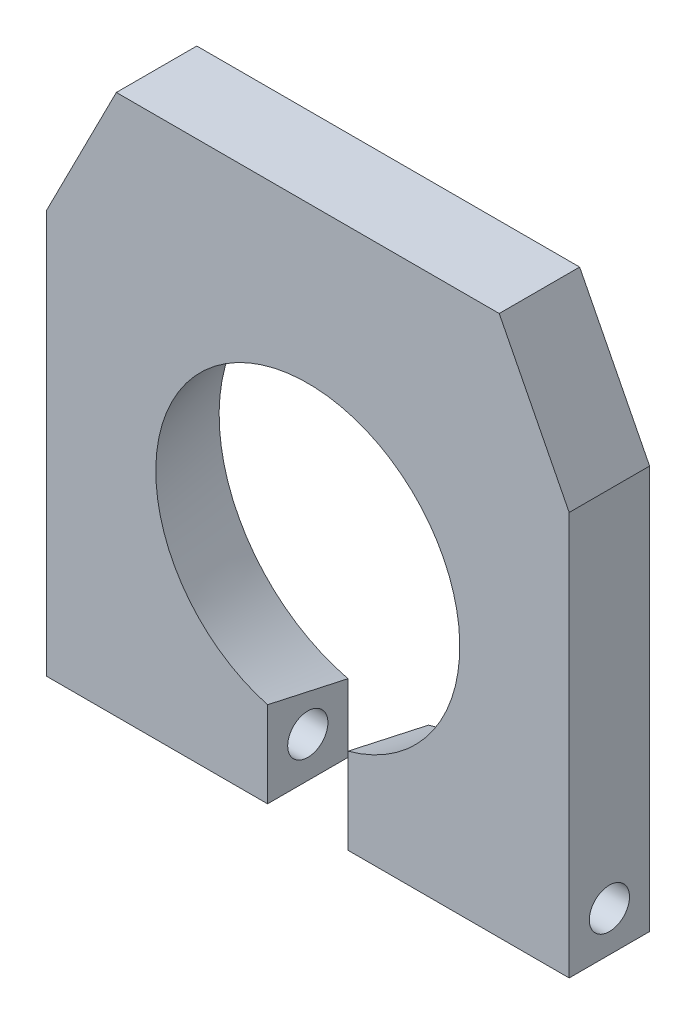
ISO-10303-21;
HEADER;
FILE_DESCRIPTION(('STEP AP214'),'2;1');
FILE_NAME('part.step','',(''),(''),'','','');
FILE_SCHEMA(('AUTOMOTIVE_DESIGN { 1 0 10303 214 1 1 1 1 }'));
ENDSEC;
DATA;
#1=APPLICATION_CONTEXT('core data for automotive mechanical design processes');
#2=APPLICATION_PROTOCOL_DEFINITION('international standard','automotive_design',2000,#1);
#3=PRODUCT_CONTEXT('',#1,'mechanical');
#4=PRODUCT('Part','Part','',(#3));
#5=PRODUCT_RELATED_PRODUCT_CATEGORY('part','',(#4));
#6=PRODUCT_DEFINITION_FORMATION('','',#4);
#7=PRODUCT_DEFINITION_CONTEXT('part definition',#1,'design');
#8=PRODUCT_DEFINITION('design','',#6,#7);
#9=PRODUCT_DEFINITION_SHAPE('','',#8);
#10=(LENGTH_UNIT() NAMED_UNIT(*) SI_UNIT(.MILLI.,.METRE.));
#11=(NAMED_UNIT(*) PLANE_ANGLE_UNIT() SI_UNIT($,.RADIAN.));
#12=(NAMED_UNIT(*) SI_UNIT($,.STERADIAN.) SOLID_ANGLE_UNIT());
#13=UNCERTAINTY_MEASURE_WITH_UNIT(LENGTH_MEASURE(1.E-05),#10,'distance_accuracy_value','');
#14=(GEOMETRIC_REPRESENTATION_CONTEXT(3) GLOBAL_UNCERTAINTY_ASSIGNED_CONTEXT((#13)) GLOBAL_UNIT_ASSIGNED_CONTEXT((#10,
#11,#12)) REPRESENTATION_CONTEXT('',''));
#15=CARTESIAN_POINT('',(0.,0.,0.));
#16=DIRECTION('',(0.,0.,1.));
#17=DIRECTION('',(1.,0.,0.));
#18=AXIS2_PLACEMENT_3D('',#15,#16,#17);
#19=CARTESIAN_POINT('',(34.925,-85.344,12.7));
#20=DIRECTION('',(-1.,0.,0.));
#21=DIRECTION('',(0.,-1.,0.));
#22=AXIS2_PLACEMENT_3D('',#19,#20,#21);
#23=PLANE('',#22);
#24=CARTESIAN_POINT('',(34.925,-78.994,6.35));
#25=DIRECTION('',(-1.,0.,0.));
#26=DIRECTION('',(0.,-1.,0.));
#27=AXIS2_PLACEMENT_3D('',#24,#25,#26);
#28=CIRCLE('',#27,3.175);
#29=CARTESIAN_POINT('',(34.925,-82.169,6.35));
#30=VERTEX_POINT('',#29);
#31=EDGE_CURVE('E139',#30,#30,#28,.T.);
#32=ORIENTED_EDGE('',*,*,#31,.T.);
#33=EDGE_LOOP('',(#32));
#34=FACE_BOUND('',#33,.T.);
#35=CARTESIAN_POINT('',(34.925,-68.7518218438866,26.4062128132452));
#36=CARTESIAN_POINT('',(34.925,-69.2101082432902,24.3501353727112));
#37=CARTESIAN_POINT('',(34.925,-69.6670810112696,22.2937656501442));
#38=CARTESIAN_POINT('',(34.925,-70.5787936427447,18.1805319832655));
#39=CARTESIAN_POINT('',(34.925,-71.0335335070522,16.1236680391338));
#40=CARTESIAN_POINT('',(34.925,-71.9411742009615,12.0095384988081));
#41=CARTESIAN_POINT('',(34.925,-72.3940750338895,9.95227290334756));
#42=CARTESIAN_POINT('',(34.925,-73.2983218476056,5.83739988256473));
#43=CARTESIAN_POINT('',(34.925,-73.7496678282345,3.77979245720744));
#44=CARTESIAN_POINT('',(34.925,-75.1017360117453,-2.3934562114455));
#45=CARTESIAN_POINT('',(34.925,-76.0004895207628,-6.50952867815485));
#46=CARTESIAN_POINT('',(34.925,-77.345707698084,-12.6842752229148));
#47=CARTESIAN_POINT('',(34.925,-77.7936288286481,-14.7426323113781));
#48=CARTESIAN_POINT('',(34.925,-78.6886164059858,-18.8595321946598));
#49=CARTESIAN_POINT('',(34.925,-79.135682852801,-20.9180749894692));
#50=CARTESIAN_POINT('',(34.925,-79.5823801274732,-22.9766979270119));
#51=B_SPLINE_CURVE_WITH_KNOTS('',3,(#35,#36,#37,#38,#39,#40,#41,#42,#43,#44,#45,#46,#47,#48,#49,
#50),.UNSPECIFIED.,.F.,.F.,(4,2,2,2,2,2,2,4),(0.,6.31959754261499,12.6391927880124,
18.9587765980228,25.2783610546314,37.9175151276736,44.2371040303297,50.5566926256409),.UNSPECIFIED.);
#52=CARTESIAN_POINT('',(34.925,-71.7887078184193,12.7));
#53=VERTEX_POINT('',#52);
#54=CARTESIAN_POINT('',(34.925,-74.5773590048811,0.));
#55=VERTEX_POINT('',#54);
#56=EDGE_CURVE('E175',#53,#55,#51,.T.);
#57=ORIENTED_EDGE('',*,*,#56,.F.);
#58=DIRECTION('',(0.,1.,0.));
#59=VECTOR('',#58,1.);
#60=CARTESIAN_POINT('',(34.925,-85.344,12.7));
#61=LINE('',#60,#59);
#62=CARTESIAN_POINT('',(34.925,-85.344,12.7));
#63=VERTEX_POINT('',#62);
#64=EDGE_CURVE('E177',#63,#53,#61,.T.);
#65=ORIENTED_EDGE('',*,*,#64,.F.);
#66=DIRECTION('',(0.,0.,-1.));
#67=VECTOR('',#66,1.);
#68=CARTESIAN_POINT('',(34.925,-85.344,12.7));
#69=LINE('',#68,#67);
#70=CARTESIAN_POINT('',(34.925,-85.344,0.));
#71=VERTEX_POINT('',#70);
#72=EDGE_CURVE('E155',#63,#71,#69,.T.);
#73=ORIENTED_EDGE('',*,*,#72,.T.);
#74=DIRECTION('',(0.,1.,0.));
#75=VECTOR('',#74,1.);
#76=CARTESIAN_POINT('',(34.925,-85.344,0.));
#77=LINE('',#76,#75);
#78=EDGE_CURVE('E141',#71,#55,#77,.T.);
#79=ORIENTED_EDGE('',*,*,#78,.T.);
#80=EDGE_LOOP('',(#57,#65,#73,#79));
#81=FACE_BOUND('',#80,.T.);
#82=ADVANCED_FACE('F32',(#34,#81),#23,.F.);
#83=CARTESIAN_POINT('',(47.625,-71.7887078184193,12.7));
#84=DIRECTION('',(1.,0.,0.));
#85=DIRECTION('',(0.,1.,0.));
#86=AXIS2_PLACEMENT_3D('',#83,#84,#85);
#87=PLANE('',#86);
#88=CARTESIAN_POINT('',(47.625,-78.994,6.35));
#89=DIRECTION('',(1.,0.,0.));
#90=DIRECTION('',(0.,1.,0.));
#91=AXIS2_PLACEMENT_3D('',#88,#89,#90);
#92=CIRCLE('',#91,3.175);
#93=CARTESIAN_POINT('',(47.625,-75.819,6.35));
#94=VERTEX_POINT('',#93);
#95=EDGE_CURVE('E257',#94,#94,#92,.T.);
#96=ORIENTED_EDGE('',*,*,#95,.T.);
#97=EDGE_LOOP('',(#96));
#98=FACE_BOUND('',#97,.T.);
#99=CARTESIAN_POINT('',(47.625,-79.5823801274732,-22.9766979270119));
#100=CARTESIAN_POINT('',(47.625,-79.135682852801,-20.9180749894692));
#101=CARTESIAN_POINT('',(47.625,-78.6886164059858,-18.8595321946598));
#102=CARTESIAN_POINT('',(47.625,-77.7936288286481,-14.7426323113781));
#103=CARTESIAN_POINT('',(47.625,-77.345707698084,-12.6842752229148));
#104=CARTESIAN_POINT('',(47.625,-76.0004895207628,-6.50952867815484));
#105=CARTESIAN_POINT('',(47.625,-75.1017360117453,-2.3934562114455));
#106=CARTESIAN_POINT('',(47.625,-73.7496678282345,3.77979245720745));
#107=CARTESIAN_POINT('',(47.625,-73.2983218476056,5.83739988256473));
#108=CARTESIAN_POINT('',(47.625,-72.3940750338895,9.95227290334757));
#109=CARTESIAN_POINT('',(47.625,-71.9411742009615,12.0095384988081));
#110=CARTESIAN_POINT('',(47.625,-71.0335335070522,16.1236680391338));
#111=CARTESIAN_POINT('',(47.625,-70.5787936427447,18.1805319832655));
#112=CARTESIAN_POINT('',(47.625,-69.6670810112696,22.2937656501442));
#113=CARTESIAN_POINT('',(47.625,-69.2101082432902,24.3501353727112));
#114=CARTESIAN_POINT('',(47.625,-68.7518218438866,26.4062128132452));
#115=B_SPLINE_CURVE_WITH_KNOTS('',3,(#99,#100,#101,#102,#103,#104,#105,#106,#107,#108,#109,#110,
#111,#112,#113,#114),.UNSPECIFIED.,.F.,.F.,(4,2,2,2,2,2,2,4),(0.,6.31958859531121,
12.6391774979673,25.2783315710095,31.597916027618,37.9174998376285,44.2370950830259,
50.5566926256409),.UNSPECIFIED.);
#116=CARTESIAN_POINT('',(47.625,-74.5773590048811,0.));
#117=VERTEX_POINT('',#116);
#118=CARTESIAN_POINT('',(47.625,-71.7887078184193,12.7));
#119=VERTEX_POINT('',#118);
#120=EDGE_CURVE('E201',#117,#119,#115,.T.);
#121=ORIENTED_EDGE('',*,*,#120,.F.);
#122=DIRECTION('',(0.,-1.,0.));
#123=VECTOR('',#122,1.);
#124=CARTESIAN_POINT('',(47.625,-71.7887078184193,0.));
#125=LINE('',#124,#123);
#126=CARTESIAN_POINT('',(47.625,-85.344,0.));
#127=VERTEX_POINT('',#126);
#128=EDGE_CURVE('E144',#117,#127,#125,.T.);
#129=ORIENTED_EDGE('',*,*,#128,.T.);
#130=DIRECTION('',(0.,0.,-1.));
#131=VECTOR('',#130,1.);
#132=CARTESIAN_POINT('',(47.625,-85.344,12.7));
#133=LINE('',#132,#131);
#134=CARTESIAN_POINT('',(47.625,-85.344,12.7));
#135=VERTEX_POINT('',#134);
#136=EDGE_CURVE('E130',#135,#127,#133,.T.);
#137=ORIENTED_EDGE('',*,*,#136,.F.);
#138=DIRECTION('',(0.,-1.,0.));
#139=VECTOR('',#138,1.);
#140=CARTESIAN_POINT('',(47.625,-71.7887078184193,12.7));
#141=LINE('',#140,#139);
#142=EDGE_CURVE('E181',#119,#135,#141,.T.);
#143=ORIENTED_EDGE('',*,*,#142,.F.);
#144=EDGE_LOOP('',(#121,#129,#137,#143));
#145=FACE_BOUND('',#144,.T.);
#146=ADVANCED_FACE('F218',(#98,#145),#87,.F.);
#147=CARTESIAN_POINT('',(41.275,-48.644,0.));
#148=DIRECTION('',(0.,0.,1.));
#149=DIRECTION('',(1.,0.,0.));
#150=AXIS2_PLACEMENT_3D('',#147,#148,#149);
#151=PLANE('',#150);
#152=DIRECTION('',(0.,-1.,0.));
#153=VECTOR('',#152,1.);
#154=CARTESIAN_POINT('',(0.,0.,0.));
#155=LINE('',#154,#153);
#156=CARTESIAN_POINT('',(0.,-21.6848834753268,0.));
#157=VERTEX_POINT('',#156);
#158=CARTESIAN_POINT('',(0.,-85.344,0.));
#159=VERTEX_POINT('',#158);
#160=EDGE_CURVE('E136',#157,#159,#155,.T.);
#161=ORIENTED_EDGE('',*,*,#160,.F.);
#162=DIRECTION('',(-0.453990499739541,-0.891006524188371,0.));
#163=VECTOR('',#162,1.);
#164=CARTESIAN_POINT('',(11.049,0.,0.));
#165=LINE('',#164,#163);
#166=CARTESIAN_POINT('',(11.049,0.,0.));
#167=VERTEX_POINT('',#166);
#168=EDGE_CURVE('E113',#167,#157,#165,.T.);
#169=ORIENTED_EDGE('',*,*,#168,.F.);
#170=DIRECTION('',(-1.,0.,0.));
#171=VECTOR('',#170,1.);
#172=CARTESIAN_POINT('',(0.,0.,0.));
#173=LINE('',#172,#171);
#174=CARTESIAN_POINT('',(71.501,0.,0.));
#175=VERTEX_POINT('',#174);
#176=EDGE_CURVE('E121',#175,#167,#173,.T.);
#177=ORIENTED_EDGE('',*,*,#176,.F.);
#178=DIRECTION('',(-0.453990499739541,0.891006524188371,0.));
#179=VECTOR('',#178,1.);
#180=CARTESIAN_POINT('',(71.501,0.,0.));
#181=LINE('',#180,#179);
#182=CARTESIAN_POINT('',(82.55,-21.6848834753268,0.));
#183=VERTEX_POINT('',#182);
#184=EDGE_CURVE('E203',#183,#175,#181,.T.);
#185=ORIENTED_EDGE('',*,*,#184,.F.);
#186=DIRECTION('',(0.,1.,0.));
#187=VECTOR('',#186,1.);
#188=CARTESIAN_POINT('',(82.55,0.,0.));
#189=LINE('',#188,#187);
#190=CARTESIAN_POINT('',(82.55,-85.344,0.));
#191=VERTEX_POINT('',#190);
#192=EDGE_CURVE('E148',#191,#183,#189,.T.);
#193=ORIENTED_EDGE('',*,*,#192,.F.);
#194=DIRECTION('',(1.,0.,0.));
#195=VECTOR('',#194,1.);
#196=CARTESIAN_POINT('',(47.625,-85.344,0.));
#197=LINE('',#196,#195);
#198=EDGE_CURVE('E146',#127,#191,#197,.T.);
#199=ORIENTED_EDGE('',*,*,#198,.F.);
#200=ORIENTED_EDGE('',*,*,#128,.F.);
#201=CARTESIAN_POINT('',(41.275,-48.644,0.));
#202=DIRECTION('',(0.,0.,1.));
#203=DIRECTION('',(1.,0.,0.));
#204=AXIS2_PLACEMENT_3D('',#201,#202,#203);
#205=CIRCLE('',#204,26.6994683332093);
#206=EDGE_CURVE('E11',#55,#117,#205,.F.);
#207=ORIENTED_EDGE('',*,*,#206,.F.);
#208=ORIENTED_EDGE('',*,*,#78,.F.);
#209=DIRECTION('',(1.,0.,0.));
#210=VECTOR('',#209,1.);
#211=CARTESIAN_POINT('',(0.,-85.344,0.));
#212=LINE('',#211,#210);
#213=EDGE_CURVE('E138',#159,#71,#212,.T.);
#214=ORIENTED_EDGE('',*,*,#213,.F.);
#215=EDGE_LOOP('',(#161,#169,#177,#185,#193,#199,#200,#207,#208,#214));
#216=FACE_BOUND('',#215,.T.);
#217=ADVANCED_FACE('F169',(#216),#151,.F.);
#218=CARTESIAN_POINT('',(0.,0.,12.7));
#219=DIRECTION('',(1.,0.,0.));
#220=DIRECTION('',(0.,1.,0.));
#221=AXIS2_PLACEMENT_3D('',#218,#219,#220);
#222=PLANE('',#221);
#223=CARTESIAN_POINT('',(0.,-78.994,6.35));
#224=DIRECTION('',(1.,0.,0.));
#225=DIRECTION('',(0.,1.,0.));
#226=AXIS2_PLACEMENT_3D('',#223,#224,#225);
#227=CIRCLE('',#226,3.175);
#228=CARTESIAN_POINT('',(0.,-75.819,6.35));
#229=VERTEX_POINT('',#228);
#230=EDGE_CURVE('E260',#229,#229,#227,.T.);
#231=ORIENTED_EDGE('',*,*,#230,.T.);
#232=EDGE_LOOP('',(#231));
#233=FACE_BOUND('',#232,.T.);
#234=DIRECTION('',(0.,-1.,0.));
#235=VECTOR('',#234,1.);
#236=CARTESIAN_POINT('',(0.,0.,12.7));
#237=LINE('',#236,#235);
#238=CARTESIAN_POINT('',(0.,-21.6848834753267,12.7));
#239=VERTEX_POINT('',#238);
#240=CARTESIAN_POINT('',(0.,-85.344,12.7));
#241=VERTEX_POINT('',#240);
#242=EDGE_CURVE('E151',#239,#241,#237,.T.);
#243=ORIENTED_EDGE('',*,*,#242,.F.);
#244=DIRECTION('',(0.,0.,-1.));
#245=VECTOR('',#244,1.);
#246=CARTESIAN_POINT('',(0.,-21.6848834753268,12.7));
#247=LINE('',#246,#245);
#248=EDGE_CURVE('E47',#239,#157,#247,.T.);
#249=ORIENTED_EDGE('',*,*,#248,.T.);
#250=ORIENTED_EDGE('',*,*,#160,.T.);
#251=DIRECTION('',(0.,0.,-1.));
#252=VECTOR('',#251,1.);
#253=CARTESIAN_POINT('',(0.,-85.344,12.7));
#254=LINE('',#253,#252);
#255=EDGE_CURVE('E40',#241,#159,#254,.T.);
#256=ORIENTED_EDGE('',*,*,#255,.F.);
#257=EDGE_LOOP('',(#243,#249,#250,#256));
#258=FACE_BOUND('',#257,.T.);
#259=ADVANCED_FACE('F34',(#233,#258),#222,.F.);
#260=CARTESIAN_POINT('',(0.,-85.344,12.7));
#261=DIRECTION('',(0.,1.,0.));
#262=DIRECTION('',(0.,0.,1.));
#263=AXIS2_PLACEMENT_3D('',#260,#261,#262);
#264=PLANE('',#263);
#265=ORIENTED_EDGE('',*,*,#213,.T.);
#266=ORIENTED_EDGE('',*,*,#72,.F.);
#267=DIRECTION('',(1.,0.,0.));
#268=VECTOR('',#267,1.);
#269=CARTESIAN_POINT('',(0.,-85.344,12.7));
#270=LINE('',#269,#268);
#271=EDGE_CURVE('E164',#241,#63,#270,.T.);
#272=ORIENTED_EDGE('',*,*,#271,.F.);
#273=ORIENTED_EDGE('',*,*,#255,.T.);
#274=EDGE_LOOP('',(#265,#266,#272,#273));
#275=FACE_BOUND('',#274,.T.);
#276=ADVANCED_FACE('F161',(#275),#264,.F.);
#277=CARTESIAN_POINT('',(47.625,-85.344,12.7));
#278=DIRECTION('',(0.,1.,0.));
#279=DIRECTION('',(-1.,0.,0.));
#280=AXIS2_PLACEMENT_3D('',#277,#278,#279);
#281=PLANE('',#280);
#282=ORIENTED_EDGE('',*,*,#198,.T.);
#283=DIRECTION('',(0.,0.,-1.));
#284=VECTOR('',#283,1.);
#285=CARTESIAN_POINT('',(82.55,-85.344,12.7));
#286=LINE('',#285,#284);
#287=CARTESIAN_POINT('',(82.55,-85.344,12.7));
#288=VERTEX_POINT('',#287);
#289=EDGE_CURVE('E126',#288,#191,#286,.T.);
#290=ORIENTED_EDGE('',*,*,#289,.F.);
#291=DIRECTION('',(1.,0.,0.));
#292=VECTOR('',#291,1.);
#293=CARTESIAN_POINT('',(47.625,-85.344,12.7));
#294=LINE('',#293,#292);
#295=EDGE_CURVE('E132',#135,#288,#294,.T.);
#296=ORIENTED_EDGE('',*,*,#295,.F.);
#297=ORIENTED_EDGE('',*,*,#136,.T.);
#298=EDGE_LOOP('',(#282,#290,#296,#297));
#299=FACE_BOUND('',#298,.T.);
#300=ADVANCED_FACE('F192',(#299),#281,.F.);
#301=CARTESIAN_POINT('',(82.55,0.,12.7));
#302=DIRECTION('',(-1.,0.,0.));
#303=DIRECTION('',(0.,-1.,0.));
#304=AXIS2_PLACEMENT_3D('',#301,#302,#303);
#305=PLANE('',#304);
#306=CARTESIAN_POINT('',(82.55,-78.994,6.35));
#307=DIRECTION('',(1.,0.,0.));
#308=DIRECTION('',(0.,1.,0.));
#309=AXIS2_PLACEMENT_3D('',#306,#307,#308);
#310=CIRCLE('',#309,3.175);
#311=CARTESIAN_POINT('',(82.55,-75.819,6.35));
#312=VERTEX_POINT('',#311);
#313=EDGE_CURVE('E263',#312,#312,#310,.T.);
#314=ORIENTED_EDGE('',*,*,#313,.F.);
#315=EDGE_LOOP('',(#314));
#316=FACE_BOUND('',#315,.T.);
#317=ORIENTED_EDGE('',*,*,#192,.T.);
#318=DIRECTION('',(0.,0.,-1.));
#319=VECTOR('',#318,1.);
#320=CARTESIAN_POINT('',(82.55,-21.6848834753268,12.7));
#321=LINE('',#320,#319);
#322=CARTESIAN_POINT('',(82.55,-21.6848834753268,12.7));
#323=VERTEX_POINT('',#322);
#324=EDGE_CURVE('E198',#323,#183,#321,.T.);
#325=ORIENTED_EDGE('',*,*,#324,.F.);
#326=DIRECTION('',(0.,1.,0.));
#327=VECTOR('',#326,1.);
#328=CARTESIAN_POINT('',(82.55,0.,12.7));
#329=LINE('',#328,#327);
#330=EDGE_CURVE('E127',#288,#323,#329,.T.);
#331=ORIENTED_EDGE('',*,*,#330,.F.);
#332=ORIENTED_EDGE('',*,*,#289,.T.);
#333=EDGE_LOOP('',(#317,#325,#331,#332));
#334=FACE_BOUND('',#333,.T.);
#335=ADVANCED_FACE('F197',(#316,#334),#305,.F.);
#336=CARTESIAN_POINT('',(0.,0.,12.7));
#337=DIRECTION('',(0.,-1.,0.));
#338=DIRECTION('',(0.,0.,-1.));
#339=AXIS2_PLACEMENT_3D('',#336,#337,#338);
#340=PLANE('',#339);
#341=ORIENTED_EDGE('',*,*,#176,.T.);
#342=DIRECTION('',(0.,0.,-1.));
#343=VECTOR('',#342,1.);
#344=CARTESIAN_POINT('',(11.049,0.,12.7));
#345=LINE('',#344,#343);
#346=CARTESIAN_POINT('',(11.049,0.,12.7));
#347=VERTEX_POINT('',#346);
#348=EDGE_CURVE('E108',#347,#167,#345,.T.);
#349=ORIENTED_EDGE('',*,*,#348,.F.);
#350=DIRECTION('',(-1.,0.,0.));
#351=VECTOR('',#350,1.);
#352=CARTESIAN_POINT('',(0.,0.,12.7));
#353=LINE('',#352,#351);
#354=CARTESIAN_POINT('',(71.5009999999999,0.,12.7));
#355=VERTEX_POINT('',#354);
#356=EDGE_CURVE('E119',#355,#347,#353,.T.);
#357=ORIENTED_EDGE('',*,*,#356,.F.);
#358=DIRECTION('',(0.,0.,-1.));
#359=VECTOR('',#358,1.);
#360=CARTESIAN_POINT('',(71.501,0.,12.7));
#361=LINE('',#360,#359);
#362=EDGE_CURVE('E55',#355,#175,#361,.T.);
#363=ORIENTED_EDGE('',*,*,#362,.T.);
#364=EDGE_LOOP('',(#341,#349,#357,#363));
#365=FACE_BOUND('',#364,.T.);
#366=ADVANCED_FACE('F118',(#365),#340,.F.);
#367=CARTESIAN_POINT('',(41.275,-48.644,12.7));
#368=DIRECTION('',(0.,0.,1.));
#369=DIRECTION('',(1.,0.,0.));
#370=AXIS2_PLACEMENT_3D('',#367,#368,#369);
#371=PLANE('',#370);
#372=DIRECTION('',(-0.453990499739541,-0.891006524188371,0.));
#373=VECTOR('',#372,1.);
#374=CARTESIAN_POINT('',(11.049,0.,12.7));
#375=LINE('',#374,#373);
#376=EDGE_CURVE('E105',#347,#239,#375,.T.);
#377=ORIENTED_EDGE('',*,*,#376,.T.);
#378=ORIENTED_EDGE('',*,*,#242,.T.);
#379=ORIENTED_EDGE('',*,*,#271,.T.);
#380=ORIENTED_EDGE('',*,*,#64,.T.);
#381=CARTESIAN_POINT('',(41.275,-48.644,12.7));
#382=DIRECTION('',(0.,0.,-1.));
#383=DIRECTION('',(1.,0.,0.));
#384=AXIS2_PLACEMENT_3D('',#381,#382,#383);
#385=CIRCLE('',#384,24.);
#386=EDGE_CURVE('E179',#53,#119,#385,.T.);
#387=ORIENTED_EDGE('',*,*,#386,.T.);
#388=ORIENTED_EDGE('',*,*,#142,.T.);
#389=ORIENTED_EDGE('',*,*,#295,.T.);
#390=ORIENTED_EDGE('',*,*,#330,.T.);
#391=DIRECTION('',(-0.453990499739541,0.891006524188371,0.));
#392=VECTOR('',#391,1.);
#393=CARTESIAN_POINT('',(71.501,0.,12.7));
#394=LINE('',#393,#392);
#395=EDGE_CURVE('E125',#323,#355,#394,.T.);
#396=ORIENTED_EDGE('',*,*,#395,.T.);
#397=ORIENTED_EDGE('',*,*,#356,.T.);
#398=EDGE_LOOP('',(#377,#378,#379,#380,#387,#388,#389,#390,#396,#397));
#399=FACE_BOUND('',#398,.T.);
#400=ADVANCED_FACE('F123',(#399),#371,.T.);
#401=CARTESIAN_POINT('',(0.,-78.994,6.35));
#402=DIRECTION('',(1.,0.,0.));
#403=DIRECTION('',(0.,1.,0.));
#404=AXIS2_PLACEMENT_3D('',#401,#402,#403);
#405=CYLINDRICAL_SURFACE('',#404,3.175);
#406=ORIENTED_EDGE('',*,*,#313,.T.);
#407=EDGE_LOOP('',(#406));
#408=FACE_BOUND('',#407,.T.);
#409=ORIENTED_EDGE('',*,*,#95,.F.);
#410=EDGE_LOOP('',(#409));
#411=FACE_BOUND('',#410,.T.);
#412=ADVANCED_FACE('F233',(#408,#411),#405,.F.);
#413=ORIENTED_EDGE('',*,*,#230,.F.);
#414=EDGE_LOOP('',(#413));
#415=FACE_BOUND('',#414,.T.);
#416=ORIENTED_EDGE('',*,*,#31,.F.);
#417=EDGE_LOOP('',(#416));
#418=FACE_BOUND('',#417,.T.);
#419=ADVANCED_FACE('F227',(#415,#418),#405,.F.);
#420=CARTESIAN_POINT('',(41.275,-48.644,12.7));
#421=DIRECTION('',(0.,0.,-1.));
#422=DIRECTION('',(-1.,0.,0.));
#423=AXIS2_PLACEMENT_3D('',#420,#421,#422);
#424=CONICAL_SURFACE('',#423,24.,0.209439510239323);
#425=ORIENTED_EDGE('',*,*,#56,.T.);
#426=ORIENTED_EDGE('',*,*,#206,.T.);
#427=ORIENTED_EDGE('',*,*,#120,.T.);
#428=ORIENTED_EDGE('',*,*,#386,.F.);
#429=EDGE_LOOP('',(#425,#426,#427,#428));
#430=FACE_BOUND('',#429,.T.);
#431=ADVANCED_FACE('F221',(#430),#424,.F.);
#432=CARTESIAN_POINT('',(71.501,0.,12.7));
#433=DIRECTION('',(-0.891006524188371,-0.453990499739541,0.));
#434=DIRECTION('',(0.453990499739541,-0.891006524188371,0.));
#435=AXIS2_PLACEMENT_3D('',#432,#433,#434);
#436=PLANE('',#435);
#437=ORIENTED_EDGE('',*,*,#184,.T.);
#438=ORIENTED_EDGE('',*,*,#362,.F.);
#439=ORIENTED_EDGE('',*,*,#395,.F.);
#440=ORIENTED_EDGE('',*,*,#324,.T.);
#441=EDGE_LOOP('',(#437,#438,#439,#440));
#442=FACE_BOUND('',#441,.T.);
#443=ADVANCED_FACE('F226',(#442),#436,.F.);
#444=CARTESIAN_POINT('',(11.049,0.,12.7));
#445=DIRECTION('',(0.891006524188371,-0.453990499739541,0.));
#446=DIRECTION('',(0.453990499739541,0.891006524188371,0.));
#447=AXIS2_PLACEMENT_3D('',#444,#445,#446);
#448=PLANE('',#447);
#449=ORIENTED_EDGE('',*,*,#168,.T.);
#450=ORIENTED_EDGE('',*,*,#248,.F.);
#451=ORIENTED_EDGE('',*,*,#376,.F.);
#452=ORIENTED_EDGE('',*,*,#348,.T.);
#453=EDGE_LOOP('',(#449,#450,#451,#452));
#454=FACE_BOUND('',#453,.T.);
#455=ADVANCED_FACE('F107',(#454),#448,.F.);
#456=CLOSED_SHELL('',(#82,#146,#217,#259,#276,#300,#335,#366,#400,#412,#419,#431,#443,#455));
#457=MANIFOLD_SOLID_BREP('B2',#456);
#458=ADVANCED_BREP_SHAPE_REPRESENTATION('',(#18,#457),#14);
#459=SHAPE_DEFINITION_REPRESENTATION(#9,#458);
ENDSEC;
END-ISO-10303-21;
